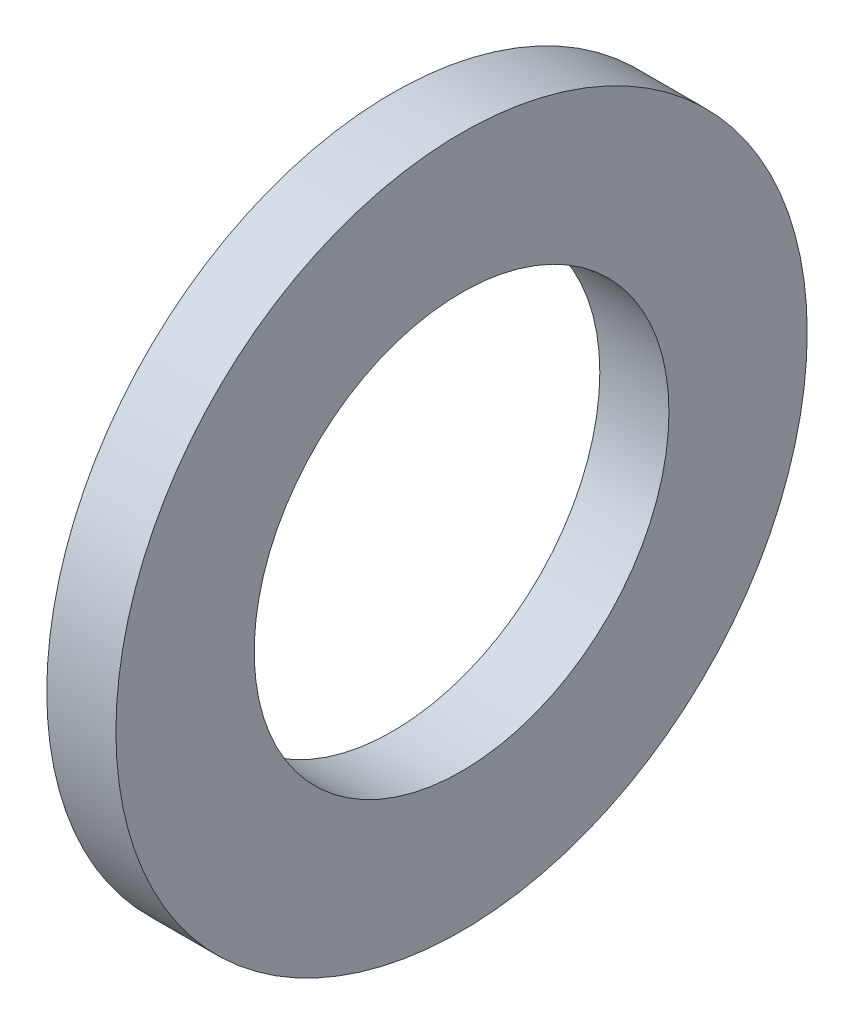
ISO-10303-21;
HEADER;
FILE_DESCRIPTION(('STEP AP214'),'2;1');
FILE_NAME('part.step','',(''),(''),'','','');
FILE_SCHEMA(('AUTOMOTIVE_DESIGN { 1 0 10303 214 1 1 1 1 }'));
ENDSEC;
DATA;
#1=APPLICATION_CONTEXT('core data for automotive mechanical design processes');
#2=APPLICATION_PROTOCOL_DEFINITION('international standard','automotive_design',2000,#1);
#3=PRODUCT_CONTEXT('',#1,'mechanical');
#4=PRODUCT('Part','Part','',(#3));
#5=PRODUCT_RELATED_PRODUCT_CATEGORY('part','',(#4));
#6=PRODUCT_DEFINITION_FORMATION('','',#4);
#7=PRODUCT_DEFINITION_CONTEXT('part definition',#1,'design');
#8=PRODUCT_DEFINITION('design','',#6,#7);
#9=PRODUCT_DEFINITION_SHAPE('','',#8);
#10=(LENGTH_UNIT() NAMED_UNIT(*) SI_UNIT(.MILLI.,.METRE.));
#11=(NAMED_UNIT(*) PLANE_ANGLE_UNIT() SI_UNIT($,.RADIAN.));
#12=(NAMED_UNIT(*) SI_UNIT($,.STERADIAN.) SOLID_ANGLE_UNIT());
#13=UNCERTAINTY_MEASURE_WITH_UNIT(LENGTH_MEASURE(1.E-05),#10,'distance_accuracy_value','');
#14=(GEOMETRIC_REPRESENTATION_CONTEXT(3) GLOBAL_UNCERTAINTY_ASSIGNED_CONTEXT((#13)) GLOBAL_UNIT_ASSIGNED_CONTEXT((#10,
#11,#12)) REPRESENTATION_CONTEXT('',''));
#15=CARTESIAN_POINT('',(0.,0.,0.));
#16=DIRECTION('',(0.,0.,1.));
#17=DIRECTION('',(1.,0.,0.));
#18=AXIS2_PLACEMENT_3D('',#15,#16,#17);
#19=CARTESIAN_POINT('',(3.175,0.,0.));
#20=DIRECTION('',(1.,0.,0.));
#21=DIRECTION('',(0.,0.,-1.));
#22=AXIS2_PLACEMENT_3D('',#19,#20,#21);
#23=PLANE('',#22);
#24=CARTESIAN_POINT('',(3.175,0.,0.));
#25=DIRECTION('',(1.,0.,0.));
#26=DIRECTION('',(0.,0.,-1.));
#27=AXIS2_PLACEMENT_3D('',#24,#25,#26);
#28=CIRCLE('',#27,15.875);
#29=CARTESIAN_POINT('',(3.175,0.,-15.875));
#30=VERTEX_POINT('',#29);
#31=EDGE_CURVE('E10',#30,#30,#28,.T.);
#32=ORIENTED_EDGE('',*,*,#31,.T.);
#33=EDGE_LOOP('',(#32));
#34=FACE_BOUND('',#33,.T.);
#35=CARTESIAN_POINT('',(3.175,0.,0.));
#36=DIRECTION('',(1.,0.,0.));
#37=DIRECTION('',(0.,0.,-1.));
#38=AXIS2_PLACEMENT_3D('',#35,#36,#37);
#39=CIRCLE('',#38,9.525);
#40=CARTESIAN_POINT('',(3.175,0.,-9.525));
#41=VERTEX_POINT('',#40);
#42=EDGE_CURVE('E43',#41,#41,#39,.T.);
#43=ORIENTED_EDGE('',*,*,#42,.F.);
#44=EDGE_LOOP('',(#43));
#45=FACE_BOUND('',#44,.T.);
#46=ADVANCED_FACE('F32',(#34,#45),#23,.T.);
#47=CARTESIAN_POINT('',(0.,0.,0.));
#48=DIRECTION('',(1.,0.,0.));
#49=DIRECTION('',(0.,0.,-1.));
#50=AXIS2_PLACEMENT_3D('',#47,#48,#49);
#51=PLANE('',#50);
#52=CARTESIAN_POINT('',(0.,0.,0.));
#53=DIRECTION('',(1.,0.,0.));
#54=DIRECTION('',(0.,0.,-1.));
#55=AXIS2_PLACEMENT_3D('',#52,#53,#54);
#56=CIRCLE('',#55,15.875);
#57=CARTESIAN_POINT('',(0.,0.,-15.875));
#58=VERTEX_POINT('',#57);
#59=EDGE_CURVE('E36',#58,#58,#56,.T.);
#60=ORIENTED_EDGE('',*,*,#59,.F.);
#61=EDGE_LOOP('',(#60));
#62=FACE_BOUND('',#61,.T.);
#63=CARTESIAN_POINT('',(0.,0.,0.));
#64=DIRECTION('',(1.,0.,0.));
#65=DIRECTION('',(0.,0.,-1.));
#66=AXIS2_PLACEMENT_3D('',#63,#64,#65);
#67=CIRCLE('',#66,9.525);
#68=CARTESIAN_POINT('',(0.,0.,-9.525));
#69=VERTEX_POINT('',#68);
#70=EDGE_CURVE('E45',#69,#69,#67,.T.);
#71=ORIENTED_EDGE('',*,*,#70,.T.);
#72=EDGE_LOOP('',(#71));
#73=FACE_BOUND('',#72,.T.);
#74=ADVANCED_FACE('F55',(#62,#73),#51,.F.);
#75=CARTESIAN_POINT('',(3.175,0.,0.));
#76=DIRECTION('',(-1.,0.,0.));
#77=DIRECTION('',(0.,0.,1.));
#78=AXIS2_PLACEMENT_3D('',#75,#76,#77);
#79=CYLINDRICAL_SURFACE('',#78,15.875);
#80=ORIENTED_EDGE('',*,*,#31,.F.);
#81=EDGE_LOOP('',(#80));
#82=FACE_BOUND('',#81,.T.);
#83=ORIENTED_EDGE('',*,*,#59,.T.);
#84=EDGE_LOOP('',(#83));
#85=FACE_BOUND('',#84,.T.);
#86=ADVANCED_FACE('F34',(#82,#85),#79,.T.);
#87=CARTESIAN_POINT('',(3.175,0.,0.));
#88=DIRECTION('',(-1.,0.,0.));
#89=DIRECTION('',(0.,0.,1.));
#90=AXIS2_PLACEMENT_3D('',#87,#88,#89);
#91=CYLINDRICAL_SURFACE('',#90,9.525);
#92=ORIENTED_EDGE('',*,*,#42,.T.);
#93=EDGE_LOOP('',(#92));
#94=FACE_BOUND('',#93,.T.);
#95=ORIENTED_EDGE('',*,*,#70,.F.);
#96=EDGE_LOOP('',(#95));
#97=FACE_BOUND('',#96,.T.);
#98=ADVANCED_FACE('F51',(#94,#97),#91,.F.);
#99=CLOSED_SHELL('',(#46,#74,#86,#98));
#100=MANIFOLD_SOLID_BREP('B2',#99);
#101=ADVANCED_BREP_SHAPE_REPRESENTATION('',(#18,#100),#14);
#102=SHAPE_DEFINITION_REPRESENTATION(#9,#101);
ENDSEC;
END-ISO-10303-21;
